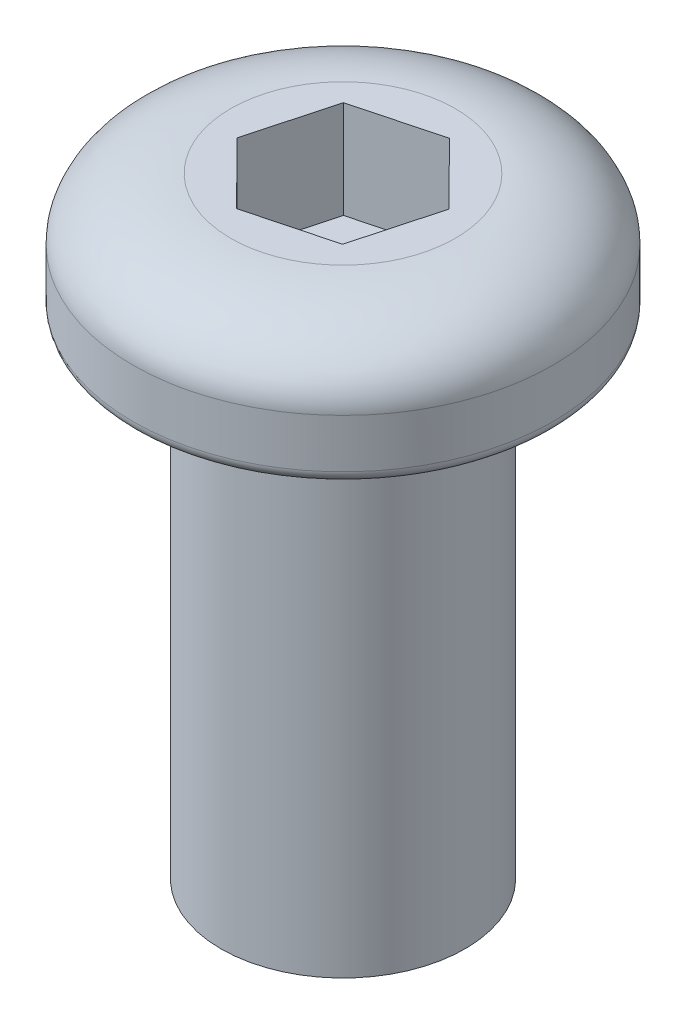
ISO-10303-21;
HEADER;
FILE_DESCRIPTION(('STEP AP214'),'2;1');
FILE_NAME('part.step','',(''),(''),'','','');
FILE_SCHEMA(('AUTOMOTIVE_DESIGN { 1 0 10303 214 1 1 1 1 }'));
ENDSEC;
DATA;
#1=APPLICATION_CONTEXT('core data for automotive mechanical design processes');
#2=APPLICATION_PROTOCOL_DEFINITION('international standard','automotive_design',2000,#1);
#3=PRODUCT_CONTEXT('',#1,'mechanical');
#4=PRODUCT('Part','Part','',(#3));
#5=PRODUCT_RELATED_PRODUCT_CATEGORY('part','',(#4));
#6=PRODUCT_DEFINITION_FORMATION('','',#4);
#7=PRODUCT_DEFINITION_CONTEXT('part definition',#1,'design');
#8=PRODUCT_DEFINITION('design','',#6,#7);
#9=PRODUCT_DEFINITION_SHAPE('','',#8);
#10=(LENGTH_UNIT() NAMED_UNIT(*) SI_UNIT(.MILLI.,.METRE.));
#11=(NAMED_UNIT(*) PLANE_ANGLE_UNIT() SI_UNIT($,.RADIAN.));
#12=(NAMED_UNIT(*) SI_UNIT($,.STERADIAN.) SOLID_ANGLE_UNIT());
#13=UNCERTAINTY_MEASURE_WITH_UNIT(LENGTH_MEASURE(1.E-05),#10,'distance_accuracy_value','');
#14=(GEOMETRIC_REPRESENTATION_CONTEXT(3) GLOBAL_UNCERTAINTY_ASSIGNED_CONTEXT((#13)) GLOBAL_UNIT_ASSIGNED_CONTEXT((#10,
#11,#12)) REPRESENTATION_CONTEXT('',''));
#15=CARTESIAN_POINT('',(0.,0.,0.));
#16=DIRECTION('',(0.,0.,1.));
#17=DIRECTION('',(1.,0.,0.));
#18=AXIS2_PLACEMENT_3D('',#15,#16,#17);
#19=CARTESIAN_POINT('',(0.,20.,0.));
#20=DIRECTION('',(0.,-1.,0.));
#21=DIRECTION('',(0.,0.,-1.));
#22=AXIS2_PLACEMENT_3D('',#19,#20,#21);
#23=CYLINDRICAL_SURFACE('',#22,5.);
#24=CARTESIAN_POINT('',(0.,20.,0.));
#25=DIRECTION('',(0.,1.,0.));
#26=DIRECTION('',(0.,0.,1.));
#27=AXIS2_PLACEMENT_3D('',#24,#25,#26);
#28=CIRCLE('',#27,5.);
#29=CARTESIAN_POINT('',(0.,20.,5.));
#30=VERTEX_POINT('',#29);
#31=EDGE_CURVE('E146',#30,#30,#28,.T.);
#32=ORIENTED_EDGE('',*,*,#31,.F.);
#33=EDGE_LOOP('',(#32));
#34=FACE_BOUND('',#33,.T.);
#35=CARTESIAN_POINT('',(0.,0.,0.));
#36=DIRECTION('',(0.,1.,0.));
#37=DIRECTION('',(0.,0.,1.));
#38=AXIS2_PLACEMENT_3D('',#35,#36,#37);
#39=CIRCLE('',#38,5.);
#40=CARTESIAN_POINT('',(0.,0.,5.));
#41=VERTEX_POINT('',#40);
#42=EDGE_CURVE('E140',#41,#41,#39,.T.);
#43=ORIENTED_EDGE('',*,*,#42,.T.);
#44=EDGE_LOOP('',(#43));
#45=FACE_BOUND('',#44,.T.);
#46=ADVANCED_FACE('F39',(#34,#45),#23,.T.);
#47=CARTESIAN_POINT('',(0.,0.,0.));
#48=DIRECTION('',(0.,1.,0.));
#49=DIRECTION('',(0.,0.,1.));
#50=AXIS2_PLACEMENT_3D('',#47,#48,#49);
#51=PLANE('',#50);
#52=ORIENTED_EDGE('',*,*,#42,.F.);
#53=EDGE_LOOP('',(#52));
#54=FACE_BOUND('',#53,.T.);
#55=ADVANCED_FACE('F184',(#54),#51,.F.);
#56=CARTESIAN_POINT('',(0.,25.,0.));
#57=DIRECTION('',(0.,-1.,0.));
#58=DIRECTION('',(0.,0.,-1.));
#59=AXIS2_PLACEMENT_3D('',#56,#57,#58);
#60=CYLINDRICAL_SURFACE('',#59,8.6);
#61=CARTESIAN_POINT('',(0.,20.5,0.));
#62=DIRECTION('',(0.,1.,0.));
#63=DIRECTION('',(0.,0.,1.));
#64=AXIS2_PLACEMENT_3D('',#61,#62,#63);
#65=CIRCLE('',#64,8.6);
#66=CARTESIAN_POINT('',(0.,20.5,8.6));
#67=VERTEX_POINT('',#66);
#68=EDGE_CURVE('E46',#67,#67,#65,.T.);
#69=ORIENTED_EDGE('',*,*,#68,.T.);
#70=EDGE_LOOP('',(#69));
#71=FACE_BOUND('',#70,.T.);
#72=CARTESIAN_POINT('',(0.,22.5,8.6));
#73=CARTESIAN_POINT('',(1.125737358671,22.5,8.6));
#74=CARTESIAN_POINT('',(2.25103181368176,22.5,8.37616501595429));
#75=CARTESIAN_POINT('',(4.33112322299778,22.5,7.51456294323984));
#76=CARTESIAN_POINT('',(5.28510179805401,22.5,6.87713483835461));
#77=CARTESIAN_POINT('',(6.8771348383546,22.5,5.28510179805401));
#78=CARTESIAN_POINT('',(7.51456294323973,22.5,4.33112322299805));
#79=CARTESIAN_POINT('',(8.37616501595441,22.5,2.25103181368149));
#80=CARTESIAN_POINT('',(8.6,22.5,1.12573735866948));
#81=CARTESIAN_POINT('',(8.6,22.5,-1.12573735866948));
#82=CARTESIAN_POINT('',(8.37616501595424,22.5,-2.2510318136819));
#83=CARTESIAN_POINT('',(7.51456294323989,22.5,-4.33112322299765));
#84=CARTESIAN_POINT('',(6.87713483835462,22.5,-5.285101798054));
#85=CARTESIAN_POINT('',(5.28510179805399,22.5,-6.87713483835462));
#86=CARTESIAN_POINT('',(4.33112322299776,22.5,-7.51456294323984));
#87=CARTESIAN_POINT('',(2.2510318136818,22.5,-8.37616501595428));
#88=CARTESIAN_POINT('',(1.12573735866948,22.5,-8.6));
#89=CARTESIAN_POINT('',(-1.12573735866947,22.5,-8.6));
#90=CARTESIAN_POINT('',(-2.25103181368148,22.5,-8.37616501595441));
#91=CARTESIAN_POINT('',(-4.33112322299804,22.5,-7.51456294323973));
#92=CARTESIAN_POINT('',(-5.28510179805426,22.5,-6.87713483835436));
#93=CARTESIAN_POINT('',(-6.87713483835436,22.5,-5.28510179805425));
#94=CARTESIAN_POINT('',(-7.51456294323978,22.5,-4.3311232229979));
#95=CARTESIAN_POINT('',(-8.37616501595434,22.5,-2.25103181368166));
#96=CARTESIAN_POINT('',(-8.6,22.5,-1.12573735866946));
#97=CARTESIAN_POINT('',(-8.6,22.5,1.12573735866949));
#98=CARTESIAN_POINT('',(-8.3761650159543,22.5,2.25103181368175));
#99=CARTESIAN_POINT('',(-7.51456294323984,22.5,4.33112322299777));
#100=CARTESIAN_POINT('',(-6.87713483835444,22.5,5.28510179805417));
#101=CARTESIAN_POINT('',(-5.28510179805421,22.5,6.87713483835441));
#102=CARTESIAN_POINT('',(-4.33112322299779,22.5,7.51456294323983));
#103=CARTESIAN_POINT('',(-2.25103181368177,22.5,8.37616501595429));
#104=CARTESIAN_POINT('',(-1.125737358671,22.5,8.6));
#105=CARTESIAN_POINT('',(0.,22.5,8.6));
#106=(BOUNDED_CURVE() B_SPLINE_CURVE(3,(#72,#73,#74,#75,#76,#77,#78,#79,#80,#81,#82,#83,#84,#85,
#86,#87,#88,#89,#90,#91,#92,#93,#94,#95,#96,#97,#98,#99,#100,#101,#102,#103,#104,#105),
.UNSPECIFIED.,.T.,.F.) B_SPLINE_CURVE_WITH_KNOTS((4,2,2,2,2,2,2,2,2,2,2,2,2,2,2,2,4),(0.,
0.392699081698724,0.785398163397448,1.17809724509617,1.5707963267949,1.96349540849362,
2.35619449019234,2.74889357189107,3.14159265358979,3.53429173528852,3.92699081698724,
4.31968989868597,4.71238898038469,5.10508806208341,5.49778714378214,5.89048622548086,
6.28318530717959),
.UNSPECIFIED.) CURVE() GEOMETRIC_REPRESENTATION_ITEM() RATIONAL_B_SPLINE_CURVE((0.999999999999999,
0.999999999999999,0.999999999999999,0.999999999999999,0.999999999999999,0.999999999999999,
0.999999999999999,0.999999999999999,0.999999999999999,0.999999999999999,0.999999999999999,
0.999999999999999,0.999999999999999,0.999999999999999,0.999999999999999,0.999999999999999,
0.999999999999999,0.999999999999999,0.999999999999999,0.999999999999999,0.999999999999999,
0.999999999999999,0.999999999999999,0.999999999999999,0.999999999999999,0.999999999999999,
0.999999999999999,0.999999999999999,0.999999999999999,0.999999999999999,0.999999999999999,
0.999999999999999,0.999999999999999,0.999999999999999)) REPRESENTATION_ITEM(''));
#107=CARTESIAN_POINT('',(0.,22.5,8.6));
#108=VERTEX_POINT('',#107);
#109=EDGE_CURVE('E242',#108,#108,#106,.F.);
#110=ORIENTED_EDGE('',*,*,#109,.T.);
#111=EDGE_LOOP('',(#110));
#112=FACE_BOUND('',#111,.T.);
#113=ADVANCED_FACE('F173',(#71,#112),#60,.T.);
#114=CARTESIAN_POINT('',(0.,25.,0.));
#115=DIRECTION('',(0.,1.,0.));
#116=DIRECTION('',(0.,0.,1.));
#117=AXIS2_PLACEMENT_3D('',#114,#115,#116);
#118=PLANE('',#117);
#119=DIRECTION('',(0.966917920556033,0.,-0.255087700423987));
#120=VECTOR('',#119,1.);
#121=CARTESIAN_POINT('',(-0.932225060476934,25.,3.42614308466806));
#122=LINE('',#121,#120);
#123=CARTESIAN_POINT('',(-0.932225060476934,25.,3.42614308466806));
#124=VERTEX_POINT('',#123);
#125=CARTESIAN_POINT('',(2.50101441808445,25.,2.52040212675154));
#126=VERTEX_POINT('',#125);
#127=EDGE_CURVE('E53',#124,#126,#122,.T.);
#128=ORIENTED_EDGE('',*,*,#127,.F.);
#129=DIRECTION('',(0.704371389038143,0.,0.709831632363955));
#130=VECTOR('',#129,1.);
#131=CARTESIAN_POINT('',(-3.43323947856139,25.,0.905740957916521));
#132=LINE('',#131,#130);
#133=CARTESIAN_POINT('',(-3.43323947856139,25.,0.905740957916521));
#134=VERTEX_POINT('',#133);
#135=EDGE_CURVE('E136',#134,#124,#132,.T.);
#136=ORIENTED_EDGE('',*,*,#135,.F.);
#137=DIRECTION('',(-0.262546531517889,0.,0.964919332787941));
#138=VECTOR('',#137,1.);
#139=CARTESIAN_POINT('',(-2.50101441808445,25.,-2.52040212675154));
#140=LINE('',#139,#138);
#141=CARTESIAN_POINT('',(-2.50101441808445,25.,-2.52040212675154));
#142=VERTEX_POINT('',#141);
#143=EDGE_CURVE('E134',#142,#134,#140,.T.);
#144=ORIENTED_EDGE('',*,*,#143,.F.);
#145=DIRECTION('',(-0.966917920556033,0.,0.255087700423987));
#146=VECTOR('',#145,1.);
#147=CARTESIAN_POINT('',(0.932225060476934,25.,-3.42614308466806));
#148=LINE('',#147,#146);
#149=CARTESIAN_POINT('',(0.932225060476934,25.,-3.42614308466806));
#150=VERTEX_POINT('',#149);
#151=EDGE_CURVE('E101',#150,#142,#148,.T.);
#152=ORIENTED_EDGE('',*,*,#151,.F.);
#153=DIRECTION('',(-0.704371389038143,0.,-0.709831632363955));
#154=VECTOR('',#153,1.);
#155=CARTESIAN_POINT('',(3.43323947856139,25.,-0.905740957916521));
#156=LINE('',#155,#154);
#157=CARTESIAN_POINT('',(3.43323947856139,25.,-0.905740957916521));
#158=VERTEX_POINT('',#157);
#159=EDGE_CURVE('E130',#158,#150,#156,.T.);
#160=ORIENTED_EDGE('',*,*,#159,.F.);
#161=DIRECTION('',(0.262546531517889,0.,-0.964919332787941));
#162=VECTOR('',#161,1.);
#163=CARTESIAN_POINT('',(2.50101441808445,25.,2.52040212675154));
#164=LINE('',#163,#162);
#165=EDGE_CURVE('E127',#126,#158,#164,.T.);
#166=ORIENTED_EDGE('',*,*,#165,.F.);
#167=EDGE_LOOP('',(#128,#136,#144,#152,#160,#166));
#168=FACE_BOUND('',#167,.T.);
#169=CARTESIAN_POINT('',(0.,25.,4.6));
#170=CARTESIAN_POINT('',(-0.0752656575314665,25.,4.60000012177592));
#171=CARTESIAN_POINT('',(-0.150529809695449,25.,4.59812937693995));
#172=CARTESIAN_POINT('',(-0.30087351396799,25.,4.59068164564769));
#173=CARTESIAN_POINT('',(-0.375953069039884,25.,4.58510471908178));
#174=CARTESIAN_POINT('',(-0.525749785277858,25.,4.57027997990893));
#175=CARTESIAN_POINT('',(-0.600466939880982,25.,4.56103210107162));
#176=CARTESIAN_POINT('',(-0.749362114299666,25.,4.53890078901402));
#177=CARTESIAN_POINT('',(-0.823540124567928,25.,4.52601729157343));
#178=CARTESIAN_POINT('',(-0.971179967374798,25.,4.496649903959));
#179=CARTESIAN_POINT('',(-1.04464179991341,25.,4.48016601378515));
#180=CARTESIAN_POINT('',(-1.19067231721078,25.,4.44363294615111));
#181=CARTESIAN_POINT('',(-1.26324101772408,25.,4.42358383167683));
#182=CARTESIAN_POINT('',(-1.40730821199914,25.,4.37995544725056));
#183=CARTESIAN_POINT('',(-1.47880672504622,25.,4.35637624099701));
#184=CARTESIAN_POINT('',(-1.62055672479532,25.,4.30572276416426));
#185=CARTESIAN_POINT('',(-1.6908081913274,25.,4.27864843711288));
#186=CARTESIAN_POINT('',(-1.82987938643145,25.,4.22104326199095));
#187=CARTESIAN_POINT('',(-1.89869911500342,25.,4.1905124139204));
#188=CARTESIAN_POINT('',(-2.03474891811077,25.,4.12609744468302));
#189=CARTESIAN_POINT('',(-2.10197901831572,25.,4.09221337771035));
#190=CARTESIAN_POINT('',(-2.23469983442638,25.,4.02119241469102));
#191=CARTESIAN_POINT('',(-2.30019051892725,25.,3.98405545996599));
#192=CARTESIAN_POINT('',(-2.42928246928898,25.,3.90662906885067));
#193=CARTESIAN_POINT('',(-2.49288370175225,25.,3.86633957678241));
#194=CARTESIAN_POINT('',(-2.61804670925419,25.,3.78270832891208));
#195=CARTESIAN_POINT('',(-2.67960848429286,25.,3.73936657311001));
#196=CARTESIAN_POINT('',(-2.80054249297582,25.,3.64973095946562));
#197=CARTESIAN_POINT('',(-2.85991476527913,25.,3.60343715378569));
#198=CARTESIAN_POINT('',(-2.97631963684663,25.,3.50799765414422));
#199=CARTESIAN_POINT('',(-3.03335227830445,25.,3.4588520116522));
#200=CARTESIAN_POINT('',(-3.14492795559905,25.,3.35780892467047));
#201=CARTESIAN_POINT('',(-3.19947095119027,25.,3.30591143572598));
#202=CARTESIAN_POINT('',(-3.30591143572598,25.,3.19947095119024));
#203=CARTESIAN_POINT('',(-3.35780892467046,25.,3.144927955599));
#204=CARTESIAN_POINT('',(-3.45885201165217,25.,3.03335227830437));
#205=CARTESIAN_POINT('',(-3.50799765414418,25.,2.97631963684655));
#206=CARTESIAN_POINT('',(-3.60343715378565,25.,2.85991476527905));
#207=CARTESIAN_POINT('',(-3.64973095946558,25.,2.80054249297576));
#208=CARTESIAN_POINT('',(-3.73936657310996,25.,2.67960848429274));
#209=CARTESIAN_POINT('',(-3.78270832891202,25.,2.61804670925398));
#210=CARTESIAN_POINT('',(-3.86633957678239,25.,2.49288370175228));
#211=CARTESIAN_POINT('',(-3.9066290688507,25.,2.42928246928934));
#212=CARTESIAN_POINT('',(-3.98405545996591,25.,2.30019051892673));
#213=CARTESIAN_POINT('',(-4.02119241469077,25.,2.23469983442466));
#214=CARTESIAN_POINT('',(-4.09221337771058,25.,2.10197901831733));
#215=CARTESIAN_POINT('',(-4.12609744468388,25.,2.03474891811692));
#216=CARTESIAN_POINT('',(-4.19051241391954,25.,1.8986991149972));
#217=CARTESIAN_POINT('',(-4.22104326198772,25.,1.82987938640833));
#218=CARTESIAN_POINT('',(-4.27864843711612,25.,1.69080819135048));
#219=CARTESIAN_POINT('',(-4.30572276417634,25.,1.62055672488148));
#220=CARTESIAN_POINT('',(-4.35637624098494,25.,1.47880672495998));
#221=CARTESIAN_POINT('',(-4.3799554472055,25.,1.40730821167742));
#222=CARTESIAN_POINT('',(-4.4235838317219,25.,1.2632410180456));
#223=CARTESIAN_POINT('',(-4.44363294631931,25.,1.19067231841107));
#224=CARTESIAN_POINT('',(-4.48016601361695,25.,1.04464179871271));
#225=CARTESIAN_POINT('',(-4.49664990333126,25.,0.971179962894277));
#226=CARTESIAN_POINT('',(-4.52601729220118,25.,0.823540129047892));
#227=CARTESIAN_POINT('',(-4.5389007913568,25.,0.74936213101994));
#228=CARTESIAN_POINT('',(-4.56103209872888,25.,0.600466923160345));
#229=CARTESIAN_POINT('',(-4.57027997116578,25.,0.525749722877023));
#230=CARTESIAN_POINT('',(-4.58510472782477,25.,0.375953131438964));
#231=CARTESIAN_POINT('',(-4.5906816782767,25.,0.300873746843283));
#232=CARTESIAN_POINT('',(-4.59812934431042,25.,0.150529576815985));
#233=CARTESIAN_POINT('',(-4.6,25.,0.0752647884079963));
#234=CARTESIAN_POINT('',(-4.6,25.,-0.075264788407981));
#235=CARTESIAN_POINT('',(-4.59812934431042,25.,-0.150529576815969));
#236=CARTESIAN_POINT('',(-4.59068167827672,25.,-0.300873746843266));
#237=CARTESIAN_POINT('',(-4.58510472782479,25.,-0.375953131438945));
#238=CARTESIAN_POINT('',(-4.57027997116582,25.,-0.525749722877002));
#239=CARTESIAN_POINT('',(-4.56103209872893,25.,-0.600466923160323));
#240=CARTESIAN_POINT('',(-4.53890079135688,25.,-0.749362131019916));
#241=CARTESIAN_POINT('',(-4.52601729220127,25.,-0.823540129047868));
#242=CARTESIAN_POINT('',(-4.49664990333136,25.,-0.971179962894252));
#243=CARTESIAN_POINT('',(-4.48016601361706,25.,-1.04464179871269));
#244=CARTESIAN_POINT('',(-4.44363294631942,25.,-1.19067231841105));
#245=CARTESIAN_POINT('',(-4.42358383172201,25.,-1.26324101804558));
#246=CARTESIAN_POINT('',(-4.3799554472056,25.,-1.4073082116774));
#247=CARTESIAN_POINT('',(-4.35637624098503,25.,-1.47880672495997));
#248=CARTESIAN_POINT('',(-4.30572276417639,25.,-1.62055672488148));
#249=CARTESIAN_POINT('',(-4.27864843711614,25.,-1.69080819135048));
#250=CARTESIAN_POINT('',(-4.22104326198769,25.,-1.82987938640835));
#251=CARTESIAN_POINT('',(-4.19051241391948,25.,-1.89869911499722));
#252=CARTESIAN_POINT('',(-4.12609744468378,25.,-2.03474891811694));
#253=CARTESIAN_POINT('',(-4.09221337771047,25.,-2.10197901831735));
#254=CARTESIAN_POINT('',(-4.02119241469064,25.,-2.23469983442468));
#255=CARTESIAN_POINT('',(-3.98405545996578,25.,-2.30019051892675));
#256=CARTESIAN_POINT('',(-3.90662906885057,25.,-2.42928246928936));
#257=CARTESIAN_POINT('',(-3.86633957678226,25.,-2.49288370175229));
#258=CARTESIAN_POINT('',(-3.7827083289119,25.,-2.61804670925398));
#259=CARTESIAN_POINT('',(-3.73936657310986,25.,-2.67960848429273));
#260=CARTESIAN_POINT('',(-3.6497309594655,25.,-2.80054249297574));
#261=CARTESIAN_POINT('',(-3.60343715378558,25.,-2.85991476527903));
#262=CARTESIAN_POINT('',(-3.50799765414413,25.,-2.97631963684653));
#263=CARTESIAN_POINT('',(-3.45885201165213,25.,-3.03335227830436));
#264=CARTESIAN_POINT('',(-3.35780892467044,25.,-3.144927955599));
#265=CARTESIAN_POINT('',(-3.30591143572597,25.,-3.19947095119024));
#266=CARTESIAN_POINT('',(-3.19947095119027,25.,-3.30591143572599));
#267=CARTESIAN_POINT('',(-3.14492795559906,25.,-3.35780892467049));
#268=CARTESIAN_POINT('',(-3.03335227830446,25.,-3.45885201165222));
#269=CARTESIAN_POINT('',(-2.97631963684664,25.,-3.50799765414424));
#270=CARTESIAN_POINT('',(-2.85991476527915,25.,-3.6034371537857));
#271=CARTESIAN_POINT('',(-2.80054249297587,25.,-3.64973095946562));
#272=CARTESIAN_POINT('',(-2.67960848429285,25.,-3.73936657310998));
#273=CARTESIAN_POINT('',(-2.61804670925409,25.,-3.78270832891203));
#274=CARTESIAN_POINT('',(-2.49288370175239,25.,-3.86633957678238));
#275=CARTESIAN_POINT('',(-2.42928246928944,25.,-3.90662906885068));
#276=CARTESIAN_POINT('',(-2.30019051892682,25.,-3.98405545996586));
#277=CARTESIAN_POINT('',(-2.23469983442473,25.,-4.02119241469071));
#278=CARTESIAN_POINT('',(-2.10197901831738,25.,-4.09221337771052));
#279=CARTESIAN_POINT('',(-2.03474891811696,25.,-4.12609744468382));
#280=CARTESIAN_POINT('',(-1.89869911499722,25.,-4.1905124139195));
#281=CARTESIAN_POINT('',(-1.82987938640835,25.,-4.2210432619877));
#282=CARTESIAN_POINT('',(-1.69080819135047,25.,-4.27864843711614));
#283=CARTESIAN_POINT('',(-1.62055672488147,25.,-4.30572276417638));
#284=CARTESIAN_POINT('',(-1.47880672495996,25.,-4.35637624098501));
#285=CARTESIAN_POINT('',(-1.40730821167738,25.,-4.37995544720558));
#286=CARTESIAN_POINT('',(-1.26324101804557,25.,-4.423583831722));
#287=CARTESIAN_POINT('',(-1.19067231841103,25.,-4.4436329463194));
#288=CARTESIAN_POINT('',(-1.04464179871267,25.,-4.48016601361704));
#289=CARTESIAN_POINT('',(-0.971179962894238,25.,-4.49664990333134));
#290=CARTESIAN_POINT('',(-0.823540129047857,25.,-4.52601729220125));
#291=CARTESIAN_POINT('',(-0.749362131019907,25.,-4.53890079135686));
#292=CARTESIAN_POINT('',(-0.600466923160318,25.,-4.56103209872893));
#293=CARTESIAN_POINT('',(-0.525749722877001,25.,-4.57027997116582));
#294=CARTESIAN_POINT('',(-0.375953131438949,25.,-4.58510472782479));
#295=CARTESIAN_POINT('',(-0.30087374684327,25.,-4.59068167827672));
#296=CARTESIAN_POINT('',(-0.150529576815975,25.,-4.59812934431042));
#297=CARTESIAN_POINT('',(-0.0752647884079872,25.,-4.6));
#298=CARTESIAN_POINT('',(0.0752647884079895,25.,-4.6));
#299=CARTESIAN_POINT('',(0.150529576815978,25.,-4.59812934431042));
#300=CARTESIAN_POINT('',(0.300873746843277,25.,-4.5906816782767));
#301=CARTESIAN_POINT('',(0.375953131438958,25.,-4.58510472782476));
#302=CARTESIAN_POINT('',(0.525749722877017,25.,-4.57027997116577));
#303=CARTESIAN_POINT('',(0.600466923160337,25.,-4.56103209872887));
#304=CARTESIAN_POINT('',(0.749362131019932,25.,-4.53890079135678));
#305=CARTESIAN_POINT('',(0.823540129047885,25.,-4.52601729220116));
#306=CARTESIAN_POINT('',(0.971179962894271,25.,-4.49664990333123));
#307=CARTESIAN_POINT('',(1.0446417987127,25.,-4.48016601361693));
#308=CARTESIAN_POINT('',(1.19067231841107,25.,-4.44363294631928));
#309=CARTESIAN_POINT('',(1.2632410180456,25.,-4.42358383172188));
#310=CARTESIAN_POINT('',(1.40730821167742,25.,-4.37995544720548));
#311=CARTESIAN_POINT('',(1.47880672495999,25.,-4.35637624098491));
#312=CARTESIAN_POINT('',(1.62055672488149,25.,-4.30572276417632));
#313=CARTESIAN_POINT('',(1.69080819135049,25.,-4.27864843711611));
#314=CARTESIAN_POINT('',(1.82987938640835,25.,-4.22104326198772));
#315=CARTESIAN_POINT('',(1.89869911499722,25.,-4.19051241391955));
#316=CARTESIAN_POINT('',(2.03474891811693,25.,-4.1260974446839));
#317=CARTESIAN_POINT('',(2.10197901831734,25.,-4.0922133777106));
#318=CARTESIAN_POINT('',(2.23469983442467,25.,-4.0211924146908));
#319=CARTESIAN_POINT('',(2.30019051892674,25.,-3.98405545996595));
#320=CARTESIAN_POINT('',(2.42928246928934,25.,-3.90662906885075));
#321=CARTESIAN_POINT('',(2.49288370175228,25.,-3.86633957678243));
#322=CARTESIAN_POINT('',(2.61804670925397,25.,-3.78270832891206));
#323=CARTESIAN_POINT('',(2.67960848429272,25.,-3.73936657311));
#324=CARTESIAN_POINT('',(2.80054249297574,25.,-3.64973095946562));
#325=CARTESIAN_POINT('',(2.85991476527903,25.,-3.60343715378569));
#326=CARTESIAN_POINT('',(2.97631963684653,25.,-3.50799765414421));
#327=CARTESIAN_POINT('',(3.03335227830436,25.,-3.4588520116522));
#328=CARTESIAN_POINT('',(3.144927955599,25.,-3.35780892467048));
#329=CARTESIAN_POINT('',(3.19947095119024,25.,-3.30591143572598));
#330=CARTESIAN_POINT('',(3.30591143572599,25.,-3.19947095119026));
#331=CARTESIAN_POINT('',(3.3578089246705,25.,-3.14492795559903));
#332=CARTESIAN_POINT('',(3.45885201165224,25.,-3.0333522783044));
#333=CARTESIAN_POINT('',(3.50799765414426,25.,-2.97631963684658));
#334=CARTESIAN_POINT('',(3.60343715378574,25.,-2.85991476527908));
#335=CARTESIAN_POINT('',(3.64973095946568,25.,-2.80054249297578));
#336=CARTESIAN_POINT('',(3.73936657311006,25.,-2.67960848429276));
#337=CARTESIAN_POINT('',(3.78270832891211,25.,-2.618046709254));
#338=CARTESIAN_POINT('',(3.86633957678248,25.,-2.4928837017523));
#339=CARTESIAN_POINT('',(3.90662906885079,25.,-2.42928246928935));
#340=CARTESIAN_POINT('',(3.98405545996598,25.,-2.30019051892674));
#341=CARTESIAN_POINT('',(4.02119241469082,25.,-2.23469983442466));
#342=CARTESIAN_POINT('',(4.09221337771062,25.,-2.10197901831733));
#343=CARTESIAN_POINT('',(4.12609744468391,25.,-2.03474891811692));
#344=CARTESIAN_POINT('',(4.19051241391955,25.,-1.8986991149972));
#345=CARTESIAN_POINT('',(4.22104326198773,25.,-1.82987938640834));
#346=CARTESIAN_POINT('',(4.27864843711611,25.,-1.69080819135049));
#347=CARTESIAN_POINT('',(4.30572276417633,25.,-1.6205567248815));
#348=CARTESIAN_POINT('',(4.35637624098492,25.,-1.47880672496));
#349=CARTESIAN_POINT('',(4.37995544720548,25.,-1.40730821167744));
#350=CARTESIAN_POINT('',(4.42358383172188,25.,-1.26324101804563));
#351=CARTESIAN_POINT('',(4.44363294631928,25.,-1.19067231841109));
#352=CARTESIAN_POINT('',(4.48016601361693,25.,-1.04464179871273));
#353=CARTESIAN_POINT('',(4.49664990333123,25.,-0.971179962894294));
#354=CARTESIAN_POINT('',(4.52601729220116,25.,-0.823540129047904));
#355=CARTESIAN_POINT('',(4.53890079135678,25.,-0.749362131019949));
#356=CARTESIAN_POINT('',(4.56103209872887,25.,-0.60046692316035));
#357=CARTESIAN_POINT('',(4.57027997116577,25.,-0.525749722877027));
#358=CARTESIAN_POINT('',(4.58510472782476,25.,-0.375953131438964));
#359=CARTESIAN_POINT('',(4.5906816782767,25.,-0.300873746843281));
#360=CARTESIAN_POINT('',(4.59812934431042,25.,-0.15052957681598));
#361=CARTESIAN_POINT('',(4.6,25.,-0.0752647884079898));
#362=CARTESIAN_POINT('',(4.6,25.,0.0752647884079886));
#363=CARTESIAN_POINT('',(4.59812934431042,25.,0.150529576815977));
#364=CARTESIAN_POINT('',(4.5906816782767,25.,0.300873746843272));
#365=CARTESIAN_POINT('',(4.58510472782476,25.,0.37595313143895));
#366=CARTESIAN_POINT('',(4.57027997116577,25.,0.525749722877003));
#367=CARTESIAN_POINT('',(4.56103209872887,25.,0.600466923160321));
#368=CARTESIAN_POINT('',(4.53890079135678,25.,0.749362131019909));
#369=CARTESIAN_POINT('',(4.52601729220116,25.,0.823540129047859));
#370=CARTESIAN_POINT('',(4.49664990333123,25.,0.97117996289424));
#371=CARTESIAN_POINT('',(4.48016601361693,25.,1.04464179871267));
#372=CARTESIAN_POINT('',(4.44363294631928,25.,1.19067231841104));
#373=CARTESIAN_POINT('',(4.42358383172188,25.,1.26324101804557));
#374=CARTESIAN_POINT('',(4.37995544720548,25.,1.40730821167739));
#375=CARTESIAN_POINT('',(4.35637624098492,25.,1.47880672495996));
#376=CARTESIAN_POINT('',(4.30572276417633,25.,1.62055672488147));
#377=CARTESIAN_POINT('',(4.27864843711611,25.,1.69080819135047));
#378=CARTESIAN_POINT('',(4.22104326198773,25.,1.82987938640835));
#379=CARTESIAN_POINT('',(4.19051241391955,25.,1.89869911499722));
#380=CARTESIAN_POINT('',(4.1260974446839,25.,2.03474891811696));
#381=CARTESIAN_POINT('',(4.0922133777106,25.,2.10197901831737));
#382=CARTESIAN_POINT('',(4.02119241469079,25.,2.2346998344247));
#383=CARTESIAN_POINT('',(3.98405545996593,25.,2.30019051892678));
#384=CARTESIAN_POINT('',(3.90662906885072,25.,2.42928246928939));
#385=CARTESIAN_POINT('',(3.8663395767824,25.,2.49288370175233));
#386=CARTESIAN_POINT('',(3.78270832891203,25.,2.61804670925402));
#387=CARTESIAN_POINT('',(3.73936657310997,25.,2.67960848429278));
#388=CARTESIAN_POINT('',(3.64973095946558,25.,2.80054249297579));
#389=CARTESIAN_POINT('',(3.60343715378565,25.,2.85991476527908));
#390=CARTESIAN_POINT('',(3.50799765414418,25.,2.97631963684657));
#391=CARTESIAN_POINT('',(3.45885201165216,25.,3.03335227830439));
#392=CARTESIAN_POINT('',(3.35780892467046,25.,3.14492795559902));
#393=CARTESIAN_POINT('',(3.30591143572597,25.,3.19947095119025));
#394=CARTESIAN_POINT('',(3.19947095119026,25.,3.30591143572599));
#395=CARTESIAN_POINT('',(3.14492795559904,25.,3.35780892467049));
#396=CARTESIAN_POINT('',(3.03335227830444,25.,3.45885201165222));
#397=CARTESIAN_POINT('',(2.97631963684663,25.,3.50799765414425));
#398=CARTESIAN_POINT('',(2.85991476527912,25.,3.60343715378573));
#399=CARTESIAN_POINT('',(2.80054249297581,25.,3.64973095946566));
#400=CARTESIAN_POINT('',(2.67960848429286,25.,3.73936657311006));
#401=CARTESIAN_POINT('',(2.61804670925419,25.,3.78270832891214));
#402=CARTESIAN_POINT('',(2.49288370175225,25.,3.86633957678248));
#403=CARTESIAN_POINT('',(2.42928246928898,25.,3.90662906885075));
#404=CARTESIAN_POINT('',(2.30019051892725,25.,3.98405545996607));
#405=CARTESIAN_POINT('',(2.23469983442638,25.,4.02119241469109));
#406=CARTESIAN_POINT('',(2.10197901831572,25.,4.09221337771042));
#407=CARTESIAN_POINT('',(2.03474891811077,25.,4.12609744468308));
#408=CARTESIAN_POINT('',(1.89869911500341,25.,4.19051241392044));
#409=CARTESIAN_POINT('',(1.82987938643144,25.,4.22104326199097));
#410=CARTESIAN_POINT('',(1.69080819132739,25.,4.27864843711286));
#411=CARTESIAN_POINT('',(1.62055672479531,25.,4.30572276416422));
#412=CARTESIAN_POINT('',(1.47880672504621,25.,4.35637624099695));
#413=CARTESIAN_POINT('',(1.40730821199913,25.,4.3799554472505));
#414=CARTESIAN_POINT('',(1.26324101772407,25.,4.42358383167676));
#415=CARTESIAN_POINT('',(1.19067231721078,25.,4.44363294615103));
#416=CARTESIAN_POINT('',(1.0446417999134,25.,4.48016601378508));
#417=CARTESIAN_POINT('',(0.971179967374793,25.,4.49664990395893));
#418=CARTESIAN_POINT('',(0.823540124567923,25.,4.52601729157337));
#419=CARTESIAN_POINT('',(0.749362114299662,25.,4.53890078901397));
#420=CARTESIAN_POINT('',(0.60046693988098,25.,4.56103210107158));
#421=CARTESIAN_POINT('',(0.525749785277857,25.,4.5702799799089));
#422=CARTESIAN_POINT('',(0.375953069039884,25.,4.58510471908176));
#423=CARTESIAN_POINT('',(0.30087351396799,25.,4.59068164564768));
#424=CARTESIAN_POINT('',(0.15052980969545,25.,4.59812937693995));
#425=CARTESIAN_POINT('',(0.0752656575314668,25.,4.60000012177592));
#426=CARTESIAN_POINT('',(0.,25.,4.6));
#427=B_SPLINE_CURVE_WITH_KNOTS('',3,(#169,#170,#171,#172,#173,#174,#175,#176,#177,#178,#179,
#180,#181,#182,#183,#184,#185,#186,#187,#188,#189,#190,#191,#192,#193,#194,#195,#196,#197,#198,
#199,#200,#201,#202,#203,#204,#205,#206,#207,#208,#209,#210,#211,#212,#213,#214,#215,#216,#217,
#218,#219,#220,#221,#222,#223,#224,#225,#226,#227,#228,#229,#230,#231,#232,#233,#234,#235,#236,
#237,#238,#239,#240,#241,#242,#243,#244,#245,#246,#247,#248,#249,#250,#251,#252,#253,#254,#255,
#256,#257,#258,#259,#260,#261,#262,#263,#264,#265,#266,#267,#268,#269,#270,#271,#272,#273,#274,
#275,#276,#277,#278,#279,#280,#281,#282,#283,#284,#285,#286,#287,#288,#289,#290,#291,#292,#293,
#294,#295,#296,#297,#298,#299,#300,#301,#302,#303,#304,#305,#306,#307,#308,#309,#310,#311,#312,
#313,#314,#315,#316,#317,#318,#319,#320,#321,#322,#323,#324,#325,#326,#327,#328,#329,#330,#331,
#332,#333,#334,#335,#336,#337,#338,#339,#340,#341,#342,#343,#344,#345,#346,#347,#348,#349,#350,
#351,#352,#353,#354,#355,#356,#357,#358,#359,#360,#361,#362,#363,#364,#365,#366,#367,#368,#369,
#370,#371,#372,#373,#374,#375,#376,#377,#378,#379,#380,#381,#382,#383,#384,#385,#386,#387,#388,
#389,#390,#391,#392,#393,#394,#395,#396,#397,#398,#399,#400,#401,#402,#403,#404,#405,#406,#407,
#408,#409,#410,#411,#412,#413,#414,#415,#416,#417,#418,#419,#420,#421,#422,#423,#424,#425,#426),
.UNSPECIFIED.,.F.,.F.,(4,2,2,2,2,2,2,2,2,2,2,2,2,2,2,2,2,2,2,2,2,2,2,2,2,2,2,2,2,2,2,2,2,2,2,2,
2,2,2,2,2,2,2,2,2,2,2,2,2,2,2,2,2,2,2,2,2,2,2,2,2,2,2,2,2,2,2,2,2,2,2,2,2,2,2,2,2,2,2,2,2,2,2,2,
2,2,2,2,2,2,2,2,2,2,2,2,2,2,2,2,2,2,2,2,2,2,2,2,2,2,2,2,2,2,2,2,2,2,2,2,2,2,2,2,2,2,2,2,4),(0.,
0.225771594671024,0.451539541054551,0.677311560871118,0.9030875690197,1.12886357716825,
1.3546355969847,1.58040354336805,1.80617513803881,2.03194673270961,2.25771467909304,
2.48348669890959,2.70926270705823,2.93503871520686,3.16081073502342,3.38657868140683,
3.61235027607763,3.83812187074843,4.06388981713185,4.28966183694841,4.51543784509705,
4.74121385324568,4.96698587306222,5.19275381944563,5.41852541411641,5.64429700878719,
5.8700649551706,6.09583697498715,6.32161298313578,6.54738899128442,6.77316101110098,
6.9989289574844,7.22470055215519,7.45047214682598,7.6762400932094,7.90201211302595,
8.12778812117458,8.35356412932321,8.57933614913977,8.8051040955232,9.03087569019403,
9.25664728486485,9.48241523124828,9.70818725106481,9.93396325921343,10.159739267362,
10.3855112871786,10.611279233562,10.8370508282328,11.0628224229036,11.288590369287,
11.5143623891035,11.7401383972521,11.9659144054008,12.1916864252173,12.4174543716008,
12.6432259662716,12.8689975609424,13.0947655073258,13.3205375271424,13.546313535291,
13.7720895434397,13.9978615632562,14.2236295096396,14.4494011043104,14.6751726989812,
14.9009406453646,15.1267126651812,15.3524886733298,15.5782646814784,15.804036701295,
16.0298046476784,16.2555762423492,16.48134783702,16.7071157834034,16.9328878032199,
17.1586638113685,17.3844398195172,17.6102118393337,17.8359797857172,18.061751380388,
18.2875229750588,18.5132909214423,18.7390629412588,18.9648389494075,19.1906149575561,
19.4163869773726,19.642154923756,19.8679265184268,20.0936981130976,20.319466059481,
20.5452380792975,20.7710140874462,20.9967900955948,21.2225621154114,21.4483300617948,
21.6741016564656,21.8998732511364,22.1256411975198,22.3514132173363,22.577189225485,
22.8029652336336,23.0287372534502,23.2545051998336,23.4802767945044,23.7060483891752,
23.9318163355586,24.1575883553751,24.3833643635238,24.6091403716724,24.834912391489,
25.0606803378724,25.2864519325432,25.512223527214,25.7379914735974,25.963763493414,
26.1895395015626,26.4153155097112,26.6410875295278,26.8668554759112,27.092627070582,
27.3183986652527,27.5441666116361,27.7699386314525,27.9957146396011,28.2214906477497,
28.4472626675662,28.6730306139498,28.8988022086208),.UNSPECIFIED.);
#428=CARTESIAN_POINT('',(0.,25.,4.6));
#429=VERTEX_POINT('',#428);
#430=EDGE_CURVE('E149',#429,#429,#427,.F.);
#431=ORIENTED_EDGE('',*,*,#430,.T.);
#432=EDGE_LOOP('',(#431));
#433=FACE_BOUND('',#432,.T.);
#434=ADVANCED_FACE('F162',(#168,#433),#118,.T.);
#435=CARTESIAN_POINT('',(0.,20.,0.));
#436=DIRECTION('',(0.,1.,0.));
#437=DIRECTION('',(0.,0.,1.));
#438=AXIS2_PLACEMENT_3D('',#435,#436,#437);
#439=PLANE('',#438);
#440=CARTESIAN_POINT('',(0.,20.,0.));
#441=DIRECTION('',(0.,1.,0.));
#442=DIRECTION('',(0.,0.,1.));
#443=AXIS2_PLACEMENT_3D('',#440,#441,#442);
#444=CIRCLE('',#443,8.1);
#445=CARTESIAN_POINT('',(0.,20.,8.1));
#446=VERTEX_POINT('',#445);
#447=EDGE_CURVE('E12',#446,#446,#444,.F.);
#448=ORIENTED_EDGE('',*,*,#447,.T.);
#449=EDGE_LOOP('',(#448));
#450=FACE_BOUND('',#449,.T.);
#451=ORIENTED_EDGE('',*,*,#31,.T.);
#452=EDGE_LOOP('',(#451));
#453=FACE_BOUND('',#452,.T.);
#454=ADVANCED_FACE('F172',(#450,#453),#439,.F.);
#455=CARTESIAN_POINT('',(0.,25.,4.6));
#456=CARTESIAN_POINT('',(0.602138587196115,25.,4.6));
#457=CARTESIAN_POINT('',(1.20404027243438,25.,4.4802743108591));
#458=CARTESIAN_POINT('',(2.31664730532444,25.,4.01941738824474));
#459=CARTESIAN_POINT('',(2.82691491523829,25.,3.67846747167808));
#460=CARTESIAN_POINT('',(3.67846747167794,25.,2.82691491523816));
#461=CARTESIAN_POINT('',(4.01941738824462,25.,2.31664730532446));
#462=CARTESIAN_POINT('',(4.48027431085922,25.,1.20404027243436));
#463=CARTESIAN_POINT('',(4.6,25.,0.602138587195301));
#464=CARTESIAN_POINT('',(4.6,25.,-0.602138587195301));
#465=CARTESIAN_POINT('',(4.48027431085922,25.,-1.20404027243449));
#466=CARTESIAN_POINT('',(4.01941738824462,25.,-2.31664730532434));
#467=CARTESIAN_POINT('',(3.67846747167816,25.,-2.82691491523821));
#468=CARTESIAN_POINT('',(2.82691491523807,25.,-3.67846747167803));
#469=CARTESIAN_POINT('',(2.31664730532441,25.,-4.01941738824462));
#470=CARTESIAN_POINT('',(1.20404027243443,25.,-4.48027431085921));
#471=CARTESIAN_POINT('',(0.602138587195302,25.,-4.6));
#472=CARTESIAN_POINT('',(-0.602138587195301,25.,-4.6));
#473=CARTESIAN_POINT('',(-1.20404027243436,25.,-4.48027431085948));
#474=CARTESIAN_POINT('',(-2.31664730532446,25.,-4.01941738824436));
#475=CARTESIAN_POINT('',(-2.82691491523834,25.,-3.67846747167816));
#476=CARTESIAN_POINT('',(-3.6784674716779,25.,-2.82691491523807));
#477=CARTESIAN_POINT('',(-4.01941738824431,25.,-2.31664730532444));
#478=CARTESIAN_POINT('',(-4.48027431085953,25.,-1.20404027243439));
#479=CARTESIAN_POINT('',(-4.6,25.,-0.602138587195294));
#480=CARTESIAN_POINT('',(-4.6,25.,0.602138587195309));
#481=CARTESIAN_POINT('',(-4.48027431085927,25.,1.20404027243445));
#482=CARTESIAN_POINT('',(-4.01941738824457,25.,2.31664730532437));
#483=CARTESIAN_POINT('',(-3.67846747167795,25.,2.82691491523815));
#484=CARTESIAN_POINT('',(-2.8269149152383,25.,3.67846747167807));
#485=CARTESIAN_POINT('',(-2.31664730532444,25.,4.01941738824457));
#486=CARTESIAN_POINT('',(-1.20404027243439,25.,4.48027431085927));
#487=CARTESIAN_POINT('',(-0.602138587196116,25.,4.6));
#488=CARTESIAN_POINT('',(0.,25.,4.6));
#489=CARTESIAN_POINT('',(0.,25.,8.6));
#490=CARTESIAN_POINT('',(1.125737358671,25.,8.6));
#491=CARTESIAN_POINT('',(2.2510318136817,25.,8.37616501595436));
#492=CARTESIAN_POINT('',(4.33112322299784,25.,7.51456294323978));
#493=CARTESIAN_POINT('',(5.28510179805414,25.,6.87713483835474));
#494=CARTESIAN_POINT('',(6.87713483835448,25.,5.28510179805388));
#495=CARTESIAN_POINT('',(7.51456294323956,25.,4.33112322299811));
#496=CARTESIAN_POINT('',(8.37616501595458,25.,2.25103181368143));
#497=CARTESIAN_POINT('',(8.6,25.,1.12573735866948));
#498=CARTESIAN_POINT('',(8.6,25.,-1.12573735866948));
#499=CARTESIAN_POINT('',(8.37616501595405,25.,-2.2510318136817));
#500=CARTESIAN_POINT('',(7.51456294324008,25.,-4.33112322299785));
#501=CARTESIAN_POINT('',(6.87713483835462,25.,-5.285101798054));
#502=CARTESIAN_POINT('',(5.28510179805399,25.,-6.87713483835463));
#503=CARTESIAN_POINT('',(4.33112322299773,25.,-7.51456294324007));
#504=CARTESIAN_POINT('',(2.25103181368184,25.,-8.37616501595405));
#505=CARTESIAN_POINT('',(1.12573735866948,25.,-8.6));
#506=CARTESIAN_POINT('',(-1.12573735866947,25.,-8.6));
#507=CARTESIAN_POINT('',(-2.25103181368155,25.,-8.37616501595458));
#508=CARTESIAN_POINT('',(-4.33112322299797,25.,-7.51456294323956));
#509=CARTESIAN_POINT('',(-5.285101798054,25.,-6.87713483835409));
#510=CARTESIAN_POINT('',(-6.87713483835463,25.,-5.28510179805452));
#511=CARTESIAN_POINT('',(-7.51456294323991,25.,-4.33112322299769));
#512=CARTESIAN_POINT('',(-8.37616501595421,25.,-2.25103181368187));
#513=CARTESIAN_POINT('',(-8.6,25.,-1.12573735866946));
#514=CARTESIAN_POINT('',(-8.6,25.,1.12573735866949));
#515=CARTESIAN_POINT('',(-8.37616501595422,25.,2.25103181368146));
#516=CARTESIAN_POINT('',(-7.51456294323992,25.,4.33112322299806));
#517=CARTESIAN_POINT('',(-6.87713483835458,25.,5.28510179805404));
#518=CARTESIAN_POINT('',(-5.28510179805407,25.,6.87713483835454));
#519=CARTESIAN_POINT('',(-4.33112322299769,25.,7.51456294323991));
#520=CARTESIAN_POINT('',(-2.25103181368187,25.,8.37616501595421));
#521=CARTESIAN_POINT('',(-1.125737358671,25.,8.6));
#522=CARTESIAN_POINT('',(0.,25.,8.6));
#523=CARTESIAN_POINT('',(0.,22.5,8.6));
#524=CARTESIAN_POINT('',(1.125737358671,22.5,8.6));
#525=CARTESIAN_POINT('',(2.25103181368176,22.5,8.3761650159543));
#526=CARTESIAN_POINT('',(4.33112322299778,22.5,7.51456294323984));
#527=CARTESIAN_POINT('',(5.28510179805401,22.5,6.87713483835461));
#528=CARTESIAN_POINT('',(6.87713483835461,22.5,5.28510179805401));
#529=CARTESIAN_POINT('',(7.51456294323973,22.5,4.33112322299805));
#530=CARTESIAN_POINT('',(8.37616501595441,22.5,2.25103181368149));
#531=CARTESIAN_POINT('',(8.6,22.5,1.12573735866948));
#532=CARTESIAN_POINT('',(8.6,22.5,-1.12573735866948));
#533=CARTESIAN_POINT('',(8.37616501595424,22.5,-2.2510318136819));
#534=CARTESIAN_POINT('',(7.51456294323989,22.5,-4.33112322299765));
#535=CARTESIAN_POINT('',(6.87713483835462,22.5,-5.285101798054));
#536=CARTESIAN_POINT('',(5.28510179805399,22.5,-6.87713483835463));
#537=CARTESIAN_POINT('',(4.33112322299776,22.5,-7.51456294323984));
#538=CARTESIAN_POINT('',(2.2510318136818,22.5,-8.37616501595428));
#539=CARTESIAN_POINT('',(1.12573735866948,22.5,-8.6));
#540=CARTESIAN_POINT('',(-1.12573735866947,22.5,-8.6));
#541=CARTESIAN_POINT('',(-2.25103181368148,22.5,-8.37616501595441));
#542=CARTESIAN_POINT('',(-4.33112322299804,22.5,-7.51456294323973));
#543=CARTESIAN_POINT('',(-5.28510179805426,22.5,-6.87713483835436));
#544=CARTESIAN_POINT('',(-6.87713483835436,22.5,-5.28510179805425));
#545=CARTESIAN_POINT('',(-7.51456294323978,22.5,-4.3311232229979));
#546=CARTESIAN_POINT('',(-8.37616501595434,22.5,-2.25103181368166));
#547=CARTESIAN_POINT('',(-8.6,22.5,-1.12573735866946));
#548=CARTESIAN_POINT('',(-8.6,22.5,1.12573735866949));
#549=CARTESIAN_POINT('',(-8.3761650159543,22.5,2.25103181368175));
#550=CARTESIAN_POINT('',(-7.51456294323984,22.5,4.33112322299777));
#551=CARTESIAN_POINT('',(-6.87713483835445,22.5,5.28510179805417));
#552=CARTESIAN_POINT('',(-5.28510179805421,22.5,6.87713483835441));
#553=CARTESIAN_POINT('',(-4.33112322299779,22.5,7.51456294323983));
#554=CARTESIAN_POINT('',(-2.25103181368177,22.5,8.37616501595429));
#555=CARTESIAN_POINT('',(-1.125737358671,22.5,8.6));
#556=CARTESIAN_POINT('',(0.,22.5,8.6));
#557=(BOUNDED_SURFACE() B_SPLINE_SURFACE(2,3,((#455,#456,#457,#458,#459,#460,#461,#462,#463,
#464,#465,#466,#467,#468,#469,#470,#471,#472,#473,#474,#475,#476,#477,#478,#479,#480,#481,#482,
#483,#484,#485,#486,#487,#488),(#489,#490,#491,#492,#493,#494,#495,#496,#497,#498,#499,#500,
#501,#502,#503,#504,#505,#506,#507,#508,#509,#510,#511,#512,#513,#514,#515,#516,#517,#518,#519,
#520,#521,#522),(#523,#524,#525,#526,#527,#528,#529,#530,#531,#532,#533,#534,#535,#536,#537,
#538,#539,#540,#541,#542,#543,#544,#545,#546,#547,#548,#549,#550,#551,#552,#553,#554,#555,
#556)),.UNSPECIFIED.,.F.,.T.,.F.) B_SPLINE_SURFACE_WITH_KNOTS((3,3),(4,2,2,2,2,2,2,2,2,2,2,2,2,
2,2,2,4),(0.,1.),(0.,0.392699081698724,0.785398163397448,1.17809724509617,1.5707963267949,
1.96349540849362,2.35619449019234,2.74889357189107,3.14159265358979,3.53429173528852,
3.92699081698724,4.31968989868597,4.71238898038469,5.10508806208341,5.49778714378214,
5.89048622548086,6.28318530717959),
.UNSPECIFIED.) GEOMETRIC_REPRESENTATION_ITEM() RATIONAL_B_SPLINE_SURFACE(((1.,1.,1.,1.,1.,1.,1.,
1.,1.,1.,1.,1.,1.,1.,1.,1.,1.,1.,1.,1.,1.,1.,1.,1.,1.,1.,1.,1.,1.,1.,1.,1.,1.,1.),
(0.707106781186548,0.707106781186548,0.707106781186548,0.707106781186548,0.707106781186548,
0.707106781186548,0.707106781186548,0.707106781186548,0.707106781186548,0.707106781186548,
0.707106781186548,0.707106781186548,0.707106781186548,0.707106781186548,0.707106781186548,
0.707106781186548,0.707106781186548,0.707106781186548,0.707106781186548,0.707106781186548,
0.707106781186548,0.707106781186548,0.707106781186548,0.707106781186548,0.707106781186548,
0.707106781186548,0.707106781186548,0.707106781186548,0.707106781186548,0.707106781186548,
0.707106781186548,0.707106781186548,0.707106781186548,0.707106781186548),(1.,1.,1.,1.,1.,1.,1.,
1.,1.,1.,1.,1.,1.,1.,1.,1.,1.,1.,1.,1.,1.,1.,1.,1.,1.,1.,1.,1.,1.,1.,1.,1.,1.,1.))) REPRESENTATION_ITEM('') SURFACE());
#558=ORIENTED_EDGE('',*,*,#109,.F.);
#559=EDGE_LOOP('',(#558));
#560=FACE_BOUND('',#559,.T.);
#561=ORIENTED_EDGE('',*,*,#430,.F.);
#562=EDGE_LOOP('',(#561));
#563=FACE_BOUND('',#562,.T.);
#564=ADVANCED_FACE('F179',(#560,#563),#557,.T.);
#565=CARTESIAN_POINT('',(-0.932225060476934,21.,3.42614308466806));
#566=DIRECTION('',(0.255087700423987,0.,0.966917920556033));
#567=DIRECTION('',(0.966917920556033,0.,-0.255087700423987));
#568=AXIS2_PLACEMENT_3D('',#565,#566,#567);
#569=PLANE('',#568);
#570=ORIENTED_EDGE('',*,*,#127,.T.);
#571=DIRECTION('',(0.,1.,0.));
#572=VECTOR('',#571,1.);
#573=CARTESIAN_POINT('',(2.50101441808445,21.,2.52040212675154));
#574=LINE('',#573,#572);
#575=CARTESIAN_POINT('',(2.50101441808445,21.,2.52040212675154));
#576=VERTEX_POINT('',#575);
#577=EDGE_CURVE('E83',#576,#126,#574,.T.);
#578=ORIENTED_EDGE('',*,*,#577,.F.);
#579=DIRECTION('',(0.966917920556033,0.,-0.255087700423987));
#580=VECTOR('',#579,1.);
#581=CARTESIAN_POINT('',(-0.932225060476934,21.,3.42614308466806));
#582=LINE('',#581,#580);
#583=CARTESIAN_POINT('',(-0.932225060476934,21.,3.42614308466806));
#584=VERTEX_POINT('',#583);
#585=EDGE_CURVE('E138',#584,#576,#582,.T.);
#586=ORIENTED_EDGE('',*,*,#585,.F.);
#587=DIRECTION('',(0.,1.,0.));
#588=VECTOR('',#587,1.);
#589=CARTESIAN_POINT('',(-0.932225060476934,21.,3.42614308466806));
#590=LINE('',#589,#588);
#591=EDGE_CURVE('E61',#584,#124,#590,.T.);
#592=ORIENTED_EDGE('',*,*,#591,.T.);
#593=EDGE_LOOP('',(#570,#578,#586,#592));
#594=FACE_BOUND('',#593,.T.);
#595=ADVANCED_FACE('F175',(#594),#569,.F.);
#596=CARTESIAN_POINT('',(-3.43323947856139,21.,0.905740957916521));
#597=DIRECTION('',(-0.709831632363955,0.,0.704371389038143));
#598=DIRECTION('',(0.704371389038143,0.,0.709831632363955));
#599=AXIS2_PLACEMENT_3D('',#596,#597,#598);
#600=PLANE('',#599);
#601=ORIENTED_EDGE('',*,*,#135,.T.);
#602=ORIENTED_EDGE('',*,*,#591,.F.);
#603=DIRECTION('',(0.704371389038143,0.,0.709831632363955));
#604=VECTOR('',#603,1.);
#605=CARTESIAN_POINT('',(-3.43323947856139,21.,0.905740957916521));
#606=LINE('',#605,#604);
#607=CARTESIAN_POINT('',(-3.43323947856139,21.,0.905740957916521));
#608=VERTEX_POINT('',#607);
#609=EDGE_CURVE('E113',#608,#584,#606,.T.);
#610=ORIENTED_EDGE('',*,*,#609,.F.);
#611=DIRECTION('',(0.,1.,0.));
#612=VECTOR('',#611,1.);
#613=CARTESIAN_POINT('',(-3.43323947856139,21.,0.905740957916521));
#614=LINE('',#613,#612);
#615=EDGE_CURVE('E105',#608,#134,#614,.T.);
#616=ORIENTED_EDGE('',*,*,#615,.T.);
#617=EDGE_LOOP('',(#601,#602,#610,#616));
#618=FACE_BOUND('',#617,.T.);
#619=ADVANCED_FACE('F289',(#618),#600,.F.);
#620=CARTESIAN_POINT('',(-2.50101441808445,21.,-2.52040212675154));
#621=DIRECTION('',(-0.964919332787941,0.,-0.262546531517889));
#622=DIRECTION('',(-0.262546531517889,0.,0.964919332787941));
#623=AXIS2_PLACEMENT_3D('',#620,#621,#622);
#624=PLANE('',#623);
#625=ORIENTED_EDGE('',*,*,#143,.T.);
#626=ORIENTED_EDGE('',*,*,#615,.F.);
#627=DIRECTION('',(-0.262546531517889,0.,0.964919332787941));
#628=VECTOR('',#627,1.);
#629=CARTESIAN_POINT('',(-2.50101441808445,21.,-2.52040212675154));
#630=LINE('',#629,#628);
#631=CARTESIAN_POINT('',(-2.50101441808445,21.,-2.52040212675154));
#632=VERTEX_POINT('',#631);
#633=EDGE_CURVE('E109',#632,#608,#630,.T.);
#634=ORIENTED_EDGE('',*,*,#633,.F.);
#635=DIRECTION('',(0.,1.,0.));
#636=VECTOR('',#635,1.);
#637=CARTESIAN_POINT('',(-2.50101441808445,21.,-2.52040212675154));
#638=LINE('',#637,#636);
#639=EDGE_CURVE('E94',#632,#142,#638,.T.);
#640=ORIENTED_EDGE('',*,*,#639,.T.);
#641=EDGE_LOOP('',(#625,#626,#634,#640));
#642=FACE_BOUND('',#641,.T.);
#643=ADVANCED_FACE('F110',(#642),#624,.F.);
#644=CARTESIAN_POINT('',(0.932225060476934,21.,-3.42614308466806));
#645=DIRECTION('',(-0.255087700423987,0.,-0.966917920556033));
#646=DIRECTION('',(-0.966917920556033,0.,0.255087700423987));
#647=AXIS2_PLACEMENT_3D('',#644,#645,#646);
#648=PLANE('',#647);
#649=ORIENTED_EDGE('',*,*,#151,.T.);
#650=ORIENTED_EDGE('',*,*,#639,.F.);
#651=DIRECTION('',(-0.966917920556033,0.,0.255087700423987));
#652=VECTOR('',#651,1.);
#653=CARTESIAN_POINT('',(0.932225060476934,21.,-3.42614308466806));
#654=LINE('',#653,#652);
#655=CARTESIAN_POINT('',(0.932225060476934,21.,-3.42614308466806));
#656=VERTEX_POINT('',#655);
#657=EDGE_CURVE('E98',#656,#632,#654,.T.);
#658=ORIENTED_EDGE('',*,*,#657,.F.);
#659=DIRECTION('',(0.,1.,0.));
#660=VECTOR('',#659,1.);
#661=CARTESIAN_POINT('',(0.932225060476934,21.,-3.42614308466806));
#662=LINE('',#661,#660);
#663=EDGE_CURVE('E106',#656,#150,#662,.T.);
#664=ORIENTED_EDGE('',*,*,#663,.T.);
#665=EDGE_LOOP('',(#649,#650,#658,#664));
#666=FACE_BOUND('',#665,.T.);
#667=ADVANCED_FACE('F96',(#666),#648,.F.);
#668=CARTESIAN_POINT('',(3.43323947856139,21.,-0.905740957916521));
#669=DIRECTION('',(0.709831632363955,0.,-0.704371389038143));
#670=DIRECTION('',(-0.704371389038143,0.,-0.709831632363955));
#671=AXIS2_PLACEMENT_3D('',#668,#669,#670);
#672=PLANE('',#671);
#673=ORIENTED_EDGE('',*,*,#159,.T.);
#674=ORIENTED_EDGE('',*,*,#663,.F.);
#675=DIRECTION('',(-0.704371389038143,0.,-0.709831632363955));
#676=VECTOR('',#675,1.);
#677=CARTESIAN_POINT('',(3.43323947856139,21.,-0.905740957916521));
#678=LINE('',#677,#676);
#679=CARTESIAN_POINT('',(3.43323947856139,21.,-0.905740957916521));
#680=VERTEX_POINT('',#679);
#681=EDGE_CURVE('E119',#680,#656,#678,.T.);
#682=ORIENTED_EDGE('',*,*,#681,.F.);
#683=DIRECTION('',(0.,1.,0.));
#684=VECTOR('',#683,1.);
#685=CARTESIAN_POINT('',(3.43323947856139,21.,-0.905740957916521));
#686=LINE('',#685,#684);
#687=EDGE_CURVE('E143',#680,#158,#686,.T.);
#688=ORIENTED_EDGE('',*,*,#687,.T.);
#689=EDGE_LOOP('',(#673,#674,#682,#688));
#690=FACE_BOUND('',#689,.T.);
#691=ADVANCED_FACE('F307',(#690),#672,.F.);
#692=CARTESIAN_POINT('',(2.50101441808445,21.,2.52040212675154));
#693=DIRECTION('',(0.964919332787941,0.,0.262546531517889));
#694=DIRECTION('',(0.262546531517889,0.,-0.964919332787942));
#695=AXIS2_PLACEMENT_3D('',#692,#693,#694);
#696=PLANE('',#695);
#697=ORIENTED_EDGE('',*,*,#165,.T.);
#698=ORIENTED_EDGE('',*,*,#687,.F.);
#699=DIRECTION('',(0.262546531517889,0.,-0.964919332787941));
#700=VECTOR('',#699,1.);
#701=CARTESIAN_POINT('',(2.50101441808445,21.,2.52040212675154));
#702=LINE('',#701,#700);
#703=EDGE_CURVE('E121',#576,#680,#702,.T.);
#704=ORIENTED_EDGE('',*,*,#703,.F.);
#705=ORIENTED_EDGE('',*,*,#577,.T.);
#706=EDGE_LOOP('',(#697,#698,#704,#705));
#707=FACE_BOUND('',#706,.T.);
#708=ADVANCED_FACE('F251',(#707),#696,.F.);
#709=CARTESIAN_POINT('',(0.,21.,0.));
#710=DIRECTION('',(0.,1.,0.));
#711=DIRECTION('',(0.,0.,1.));
#712=AXIS2_PLACEMENT_3D('',#709,#710,#711);
#713=PLANE('',#712);
#714=ORIENTED_EDGE('',*,*,#585,.T.);
#715=ORIENTED_EDGE('',*,*,#703,.T.);
#716=ORIENTED_EDGE('',*,*,#681,.T.);
#717=ORIENTED_EDGE('',*,*,#657,.T.);
#718=ORIENTED_EDGE('',*,*,#633,.T.);
#719=ORIENTED_EDGE('',*,*,#609,.T.);
#720=EDGE_LOOP('',(#714,#715,#716,#717,#718,#719));
#721=FACE_BOUND('',#720,.T.);
#722=ADVANCED_FACE('F116',(#721),#713,.T.);
#723=CARTESIAN_POINT('',(0.,20.5,0.));
#724=DIRECTION('',(0.,1.,0.));
#725=DIRECTION('',(0.,0.,1.));
#726=AXIS2_PLACEMENT_3D('',#723,#724,#725);
#727=TOROIDAL_SURFACE('',#726,8.1,0.5);
#728=ORIENTED_EDGE('',*,*,#447,.F.);
#729=EDGE_LOOP('',(#728));
#730=FACE_BOUND('',#729,.T.);
#731=ORIENTED_EDGE('',*,*,#68,.F.);
#732=EDGE_LOOP('',(#731));
#733=FACE_BOUND('',#732,.T.);
#734=ADVANCED_FACE('F41',(#730,#733),#727,.T.);
#735=CLOSED_SHELL('',(#46,#55,#113,#434,#454,#564,#595,#619,#643,#667,#691,#708,#722,#734));
#736=MANIFOLD_SOLID_BREP('B2',#735);
#737=ADVANCED_BREP_SHAPE_REPRESENTATION('',(#18,#736),#14);
#738=SHAPE_DEFINITION_REPRESENTATION(#9,#737);
ENDSEC;
END-ISO-10303-21;
